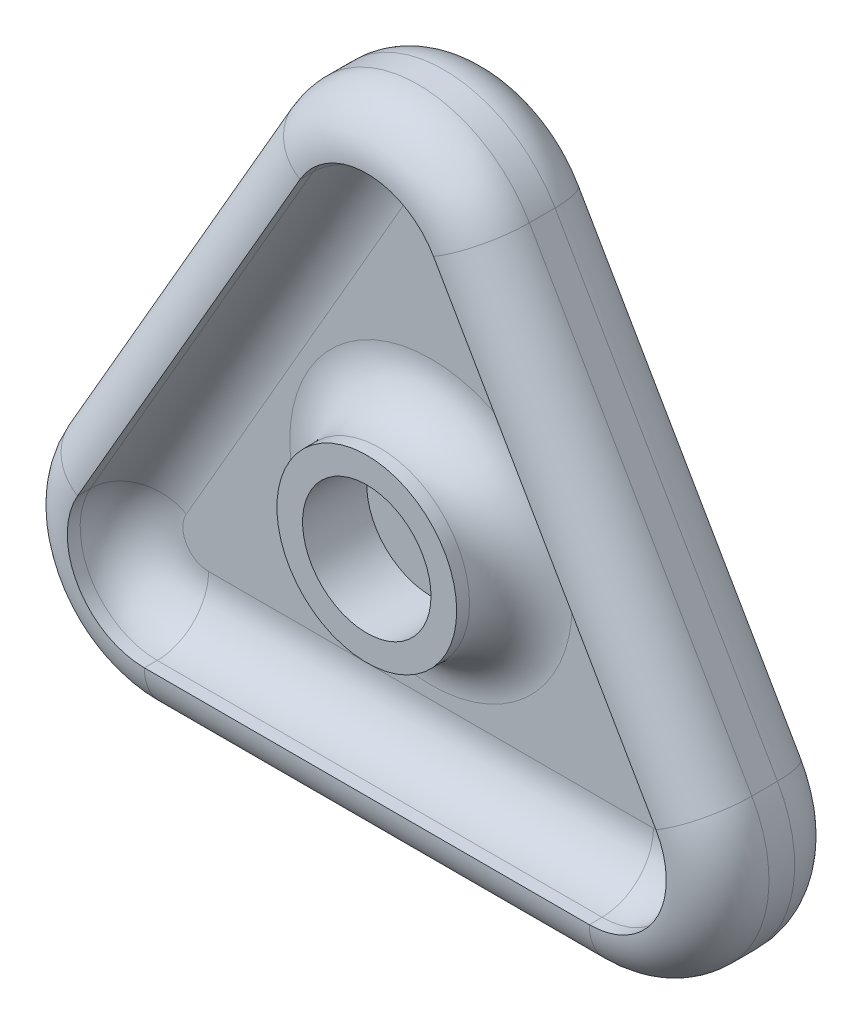
ISO-10303-21;
HEADER;
FILE_DESCRIPTION(('STEP AP214'),'2;1');
FILE_NAME('part.step','',(''),(''),'','','');
FILE_SCHEMA(('AUTOMOTIVE_DESIGN { 1 0 10303 214 1 1 1 1 }'));
ENDSEC;
DATA;
#1=APPLICATION_CONTEXT('core data for automotive mechanical design processes');
#2=APPLICATION_PROTOCOL_DEFINITION('international standard','automotive_design',2000,#1);
#3=PRODUCT_CONTEXT('',#1,'mechanical');
#4=PRODUCT('Part','Part','',(#3));
#5=PRODUCT_RELATED_PRODUCT_CATEGORY('part','',(#4));
#6=PRODUCT_DEFINITION_FORMATION('','',#4);
#7=PRODUCT_DEFINITION_CONTEXT('part definition',#1,'design');
#8=PRODUCT_DEFINITION('design','',#6,#7);
#9=PRODUCT_DEFINITION_SHAPE('','',#8);
#10=(LENGTH_UNIT() NAMED_UNIT(*) SI_UNIT(.MILLI.,.METRE.));
#11=(NAMED_UNIT(*) PLANE_ANGLE_UNIT() SI_UNIT($,.RADIAN.));
#12=(NAMED_UNIT(*) SI_UNIT($,.STERADIAN.) SOLID_ANGLE_UNIT());
#13=UNCERTAINTY_MEASURE_WITH_UNIT(LENGTH_MEASURE(1.E-05),#10,'distance_accuracy_value','');
#14=(GEOMETRIC_REPRESENTATION_CONTEXT(3) GLOBAL_UNCERTAINTY_ASSIGNED_CONTEXT((#13)) GLOBAL_UNIT_ASSIGNED_CONTEXT((#10,
#11,#12)) REPRESENTATION_CONTEXT('',''));
#15=CARTESIAN_POINT('',(0.,0.,0.));
#16=DIRECTION('',(0.,0.,1.));
#17=DIRECTION('',(1.,0.,0.));
#18=AXIS2_PLACEMENT_3D('',#15,#16,#17);
#19=CARTESIAN_POINT('',(17.3205080756888,-10.,8.0742429890584));
#20=DIRECTION('',(0.,0.,-1.));
#21=DIRECTION('',(-1.,0.,0.));
#22=AXIS2_PLACEMENT_3D('',#19,#20,#21);
#23=CYLINDRICAL_SURFACE('',#22,10.);
#24=DIRECTION('',(0.,0.,-1.));
#25=VECTOR('',#24,1.);
#26=CARTESIAN_POINT('',(17.3205080756886,-20.,8.0742429890584));
#27=LINE('',#26,#25);
#28=CARTESIAN_POINT('',(17.3205080756886,-20.,4.0742429890584));
#29=VERTEX_POINT('',#28);
#30=CARTESIAN_POINT('',(17.3205080756886,-20.,2.0742429890584));
#31=VERTEX_POINT('',#30);
#32=EDGE_CURVE('E227',#29,#31,#27,.T.);
#33=ORIENTED_EDGE('',*,*,#32,.T.);
#34=CARTESIAN_POINT('',(17.3205080756888,-10.,2.0742429890584));
#35=DIRECTION('',(0.,0.,-1.));
#36=DIRECTION('',(-1.,0.,0.));
#37=AXIS2_PLACEMENT_3D('',#34,#35,#36);
#38=CIRCLE('',#37,10.);
#39=CARTESIAN_POINT('',(25.9807621135331,-4.99999999999989,2.0742429890584));
#40=VERTEX_POINT('',#39);
#41=EDGE_CURVE('E11',#31,#40,#38,.F.);
#42=ORIENTED_EDGE('',*,*,#41,.T.);
#43=DIRECTION('',(0.,0.,-1.));
#44=VECTOR('',#43,1.);
#45=CARTESIAN_POINT('',(25.9807621135331,-4.99999999999989,8.0742429890584));
#46=LINE('',#45,#44);
#47=CARTESIAN_POINT('',(25.9807621135331,-4.99999999999989,4.0742429890584));
#48=VERTEX_POINT('',#47);
#49=EDGE_CURVE('E253',#48,#40,#46,.T.);
#50=ORIENTED_EDGE('',*,*,#49,.F.);
#51=CARTESIAN_POINT('',(17.3205080756888,-10.,4.0742429890584));
#52=DIRECTION('',(0.,0.,-1.));
#53=DIRECTION('',(-1.,0.,0.));
#54=AXIS2_PLACEMENT_3D('',#51,#52,#53);
#55=CIRCLE('',#54,10.);
#56=EDGE_CURVE('E269',#48,#29,#55,.T.);
#57=ORIENTED_EDGE('',*,*,#56,.T.);
#58=EDGE_LOOP('',(#33,#42,#50,#57));
#59=FACE_BOUND('',#58,.T.);
#60=ADVANCED_FACE('F38',(#59),#23,.T.);
#61=CARTESIAN_POINT('',(25.9807621135331,-4.99999999999989,8.0742429890584));
#62=DIRECTION('',(-0.866025403784439,-0.5,0.));
#63=DIRECTION('',(0.5,-0.866025403784439,0.));
#64=AXIS2_PLACEMENT_3D('',#61,#62,#63);
#65=PLANE('',#64);
#66=ORIENTED_EDGE('',*,*,#49,.T.);
#67=DIRECTION('',(-0.5,0.866025403784439,0.));
#68=VECTOR('',#67,1.);
#69=CARTESIAN_POINT('',(8.66025403784446,24.9999999999999,2.0742429890584));
#70=LINE('',#69,#68);
#71=CARTESIAN_POINT('',(8.66025403784446,24.9999999999999,2.0742429890584));
#72=VERTEX_POINT('',#71);
#73=EDGE_CURVE('E315',#40,#72,#70,.T.);
#74=ORIENTED_EDGE('',*,*,#73,.T.);
#75=DIRECTION('',(0.,0.,-1.));
#76=VECTOR('',#75,1.);
#77=CARTESIAN_POINT('',(8.66025403784446,24.9999999999999,8.0742429890584));
#78=LINE('',#77,#76);
#79=CARTESIAN_POINT('',(8.66025403784446,24.9999999999999,4.0742429890584));
#80=VERTEX_POINT('',#79);
#81=EDGE_CURVE('E249',#80,#72,#78,.T.);
#82=ORIENTED_EDGE('',*,*,#81,.F.);
#83=DIRECTION('',(-0.5,0.866025403784439,0.));
#84=VECTOR('',#83,1.);
#85=CARTESIAN_POINT('',(25.9807621135331,-4.99999999999989,4.0742429890584));
#86=LINE('',#85,#84);
#87=EDGE_CURVE('E197',#80,#48,#86,.F.);
#88=ORIENTED_EDGE('',*,*,#87,.T.);
#89=EDGE_LOOP('',(#66,#74,#82,#88));
#90=FACE_BOUND('',#89,.T.);
#91=ADVANCED_FACE('F388',(#90),#65,.F.);
#92=CARTESIAN_POINT('',(0.,20.,8.0742429890584));
#93=DIRECTION('',(0.,0.,-1.));
#94=DIRECTION('',(-1.,0.,0.));
#95=AXIS2_PLACEMENT_3D('',#92,#93,#94);
#96=CYLINDRICAL_SURFACE('',#95,10.);
#97=ORIENTED_EDGE('',*,*,#81,.T.);
#98=CARTESIAN_POINT('',(0.,20.,2.0742429890584));
#99=DIRECTION('',(0.,0.,-1.));
#100=DIRECTION('',(-1.,0.,0.));
#101=AXIS2_PLACEMENT_3D('',#98,#99,#100);
#102=CIRCLE('',#101,10.);
#103=CARTESIAN_POINT('',(-8.66025403784445,24.9999999999999,2.0742429890584));
#104=VERTEX_POINT('',#103);
#105=EDGE_CURVE('E346',#72,#104,#102,.F.);
#106=ORIENTED_EDGE('',*,*,#105,.T.);
#107=DIRECTION('',(0.,0.,-1.));
#108=VECTOR('',#107,1.);
#109=CARTESIAN_POINT('',(-8.66025403784445,24.9999999999999,8.0742429890584));
#110=LINE('',#109,#108);
#111=CARTESIAN_POINT('',(-8.66025403784445,24.9999999999999,4.0742429890584));
#112=VERTEX_POINT('',#111);
#113=EDGE_CURVE('E245',#112,#104,#110,.T.);
#114=ORIENTED_EDGE('',*,*,#113,.F.);
#115=CARTESIAN_POINT('',(0.,20.,4.0742429890584));
#116=DIRECTION('',(0.,0.,-1.));
#117=DIRECTION('',(-1.,0.,0.));
#118=AXIS2_PLACEMENT_3D('',#115,#116,#117);
#119=CIRCLE('',#118,10.);
#120=EDGE_CURVE('E266',#112,#80,#119,.T.);
#121=ORIENTED_EDGE('',*,*,#120,.T.);
#122=EDGE_LOOP('',(#97,#106,#114,#121));
#123=FACE_BOUND('',#122,.T.);
#124=ADVANCED_FACE('F391',(#123),#96,.T.);
#125=CARTESIAN_POINT('',(-8.66025403784445,24.9999999999999,8.0742429890584));
#126=DIRECTION('',(0.866025403784439,-0.5,0.));
#127=DIRECTION('',(0.5,0.866025403784439,0.));
#128=AXIS2_PLACEMENT_3D('',#125,#126,#127);
#129=PLANE('',#128);
#130=ORIENTED_EDGE('',*,*,#113,.T.);
#131=DIRECTION('',(-0.5,-0.866025403784439,0.));
#132=VECTOR('',#131,1.);
#133=CARTESIAN_POINT('',(-25.9807621135331,-4.99999999999989,2.0742429890584));
#134=LINE('',#133,#132);
#135=CARTESIAN_POINT('',(-25.9807621135331,-4.99999999999989,2.0742429890584));
#136=VERTEX_POINT('',#135);
#137=EDGE_CURVE('E348',#104,#136,#134,.T.);
#138=ORIENTED_EDGE('',*,*,#137,.T.);
#139=DIRECTION('',(0.,0.,-1.));
#140=VECTOR('',#139,1.);
#141=CARTESIAN_POINT('',(-25.9807621135331,-4.99999999999989,8.0742429890584));
#142=LINE('',#141,#140);
#143=CARTESIAN_POINT('',(-25.9807621135331,-4.99999999999989,4.0742429890584));
#144=VERTEX_POINT('',#143);
#145=EDGE_CURVE('E242',#144,#136,#142,.T.);
#146=ORIENTED_EDGE('',*,*,#145,.F.);
#147=DIRECTION('',(-0.5,-0.866025403784439,0.));
#148=VECTOR('',#147,1.);
#149=CARTESIAN_POINT('',(-8.66025403784445,24.9999999999999,4.0742429890584));
#150=LINE('',#149,#148);
#151=EDGE_CURVE('E264',#144,#112,#150,.F.);
#152=ORIENTED_EDGE('',*,*,#151,.T.);
#153=EDGE_LOOP('',(#130,#138,#146,#152));
#154=FACE_BOUND('',#153,.T.);
#155=ADVANCED_FACE('F683',(#154),#129,.F.);
#156=CARTESIAN_POINT('',(-17.3205080756888,-10.,8.0742429890584));
#157=DIRECTION('',(0.,0.,-1.));
#158=DIRECTION('',(-1.,0.,0.));
#159=AXIS2_PLACEMENT_3D('',#156,#157,#158);
#160=CYLINDRICAL_SURFACE('',#159,9.99999999999999);
#161=ORIENTED_EDGE('',*,*,#145,.T.);
#162=CARTESIAN_POINT('',(-17.3205080756888,-10.,2.0742429890584));
#163=DIRECTION('',(0.,0.,-1.));
#164=DIRECTION('',(-1.,0.,0.));
#165=AXIS2_PLACEMENT_3D('',#162,#163,#164);
#166=CIRCLE('',#165,9.99999999999999);
#167=CARTESIAN_POINT('',(-17.3205080756886,-20.,2.0742429890584));
#168=VERTEX_POINT('',#167);
#169=EDGE_CURVE('E62',#136,#168,#166,.F.);
#170=ORIENTED_EDGE('',*,*,#169,.T.);
#171=DIRECTION('',(0.,0.,-1.));
#172=VECTOR('',#171,1.);
#173=CARTESIAN_POINT('',(-17.3205080756886,-20.,8.0742429890584));
#174=LINE('',#173,#172);
#175=CARTESIAN_POINT('',(-17.3205080756886,-20.,4.0742429890584));
#176=VERTEX_POINT('',#175);
#177=EDGE_CURVE('E240',#176,#168,#174,.T.);
#178=ORIENTED_EDGE('',*,*,#177,.F.);
#179=CARTESIAN_POINT('',(-17.3205080756888,-10.,4.0742429890584));
#180=DIRECTION('',(0.,0.,-1.));
#181=DIRECTION('',(-1.,0.,0.));
#182=AXIS2_PLACEMENT_3D('',#179,#180,#181);
#183=CIRCLE('',#182,9.99999999999999);
#184=EDGE_CURVE('E261',#176,#144,#183,.T.);
#185=ORIENTED_EDGE('',*,*,#184,.T.);
#186=EDGE_LOOP('',(#161,#170,#178,#185));
#187=FACE_BOUND('',#186,.T.);
#188=ADVANCED_FACE('F674',(#187),#160,.T.);
#189=CARTESIAN_POINT('',(-17.3205080756886,-20.,8.0742429890584));
#190=DIRECTION('',(0.,1.,0.));
#191=DIRECTION('',(-1.,0.,0.));
#192=AXIS2_PLACEMENT_3D('',#189,#190,#191);
#193=PLANE('',#192);
#194=ORIENTED_EDGE('',*,*,#177,.T.);
#195=DIRECTION('',(1.,0.,0.));
#196=VECTOR('',#195,1.);
#197=CARTESIAN_POINT('',(17.3205080756886,-20.,2.0742429890584));
#198=LINE('',#197,#196);
#199=EDGE_CURVE('E47',#168,#31,#198,.T.);
#200=ORIENTED_EDGE('',*,*,#199,.T.);
#201=ORIENTED_EDGE('',*,*,#32,.F.);
#202=DIRECTION('',(1.,0.,0.));
#203=VECTOR('',#202,1.);
#204=CARTESIAN_POINT('',(-17.3205080756886,-20.,4.0742429890584));
#205=LINE('',#204,#203);
#206=EDGE_CURVE('E271',#29,#176,#205,.F.);
#207=ORIENTED_EDGE('',*,*,#206,.T.);
#208=EDGE_LOOP('',(#194,#200,#201,#207));
#209=FACE_BOUND('',#208,.T.);
#210=ADVANCED_FACE('F665',(#209),#193,.F.);
#211=CARTESIAN_POINT('',(17.3205080756888,-10.,-1.9257570109416));
#212=DIRECTION('',(0.,0.,-1.));
#213=DIRECTION('',(-1.,0.,0.));
#214=AXIS2_PLACEMENT_3D('',#211,#212,#213);
#215=PLANE('',#214);
#216=CARTESIAN_POINT('',(0.,20.,-1.9257570109416));
#217=DIRECTION('',(0.,0.,-1.));
#218=DIRECTION('',(-1.,0.,0.));
#219=AXIS2_PLACEMENT_3D('',#216,#217,#218);
#220=CIRCLE('',#219,6.);
#221=CARTESIAN_POINT('',(-5.19615242270667,22.9999999999999,-1.9257570109416));
#222=VERTEX_POINT('',#221);
#223=CARTESIAN_POINT('',(5.1961524227067,22.9999999999999,-1.9257570109416));
#224=VERTEX_POINT('',#223);
#225=EDGE_CURVE('E341',#222,#224,#220,.T.);
#226=ORIENTED_EDGE('',*,*,#225,.T.);
#227=DIRECTION('',(-0.5,0.866025403784439,0.));
#228=VECTOR('',#227,1.);
#229=CARTESIAN_POINT('',(22.5166604983953,-6.99999999999989,-1.9257570109416));
#230=LINE('',#229,#228);
#231=CARTESIAN_POINT('',(22.5166604983953,-6.99999999999989,-1.9257570109416));
#232=VERTEX_POINT('',#231);
#233=EDGE_CURVE('E343',#224,#232,#230,.F.);
#234=ORIENTED_EDGE('',*,*,#233,.T.);
#235=CARTESIAN_POINT('',(17.3205080756888,-10.,-1.9257570109416));
#236=DIRECTION('',(0.,0.,-1.));
#237=DIRECTION('',(-1.,0.,0.));
#238=AXIS2_PLACEMENT_3D('',#235,#236,#237);
#239=CIRCLE('',#238,6.);
#240=CARTESIAN_POINT('',(17.3205080756886,-16.,-1.9257570109416));
#241=VERTEX_POINT('',#240);
#242=EDGE_CURVE('E333',#232,#241,#239,.T.);
#243=ORIENTED_EDGE('',*,*,#242,.T.);
#244=DIRECTION('',(1.,0.,0.));
#245=VECTOR('',#244,1.);
#246=CARTESIAN_POINT('',(-17.3205080756886,-16.,-1.9257570109416));
#247=LINE('',#246,#245);
#248=CARTESIAN_POINT('',(-17.3205080756887,-16.,-1.9257570109416));
#249=VERTEX_POINT('',#248);
#250=EDGE_CURVE('E335',#241,#249,#247,.F.);
#251=ORIENTED_EDGE('',*,*,#250,.T.);
#252=CARTESIAN_POINT('',(-17.3205080756888,-10.,-1.9257570109416));
#253=DIRECTION('',(0.,0.,-1.));
#254=DIRECTION('',(-1.,0.,0.));
#255=AXIS2_PLACEMENT_3D('',#252,#253,#254);
#256=CIRCLE('',#255,5.99999999999999);
#257=CARTESIAN_POINT('',(-22.5166604983953,-6.99999999999989,-1.9257570109416));
#258=VERTEX_POINT('',#257);
#259=EDGE_CURVE('E337',#249,#258,#256,.T.);
#260=ORIENTED_EDGE('',*,*,#259,.T.);
#261=DIRECTION('',(-0.5,-0.866025403784439,0.));
#262=VECTOR('',#261,1.);
#263=CARTESIAN_POINT('',(-5.1961524227067,22.9999999999999,-1.9257570109416));
#264=LINE('',#263,#262);
#265=EDGE_CURVE('E339',#258,#222,#264,.F.);
#266=ORIENTED_EDGE('',*,*,#265,.T.);
#267=EDGE_LOOP('',(#226,#234,#243,#251,#260,#266));
#268=FACE_BOUND('',#267,.T.);
#269=ADVANCED_FACE('F376',(#268),#215,.T.);
#270=CARTESIAN_POINT('',(17.3205080756888,-10.,3.0742429890584));
#271=DIRECTION('',(0.,0.,1.));
#272=DIRECTION('',(1.,0.,0.));
#273=AXIS2_PLACEMENT_3D('',#270,#271,#272);
#274=CYLINDRICAL_SURFACE('',#273,6.);
#275=DIRECTION('',(0.,0.,1.));
#276=VECTOR('',#275,1.);
#277=CARTESIAN_POINT('',(22.5166604983954,-6.99999999999993,3.0742429890584));
#278=LINE('',#277,#276);
#279=CARTESIAN_POINT('',(22.5166604983954,-6.99999999999993,7.0742429890584));
#280=VERTEX_POINT('',#279);
#281=CARTESIAN_POINT('',(22.5166604983954,-6.99999999999993,8.0742429890584));
#282=VERTEX_POINT('',#281);
#283=EDGE_CURVE('E179',#280,#282,#278,.T.);
#284=ORIENTED_EDGE('',*,*,#283,.F.);
#285=CARTESIAN_POINT('',(17.3205080756888,-10.,7.0742429890584));
#286=DIRECTION('',(0.,0.,1.));
#287=DIRECTION('',(1.,0.,0.));
#288=AXIS2_PLACEMENT_3D('',#285,#286,#287);
#289=CIRCLE('',#288,6.);
#290=CARTESIAN_POINT('',(17.3205080756887,-16.,7.0742429890584));
#291=VERTEX_POINT('',#290);
#292=EDGE_CURVE('E310',#280,#291,#289,.F.);
#293=ORIENTED_EDGE('',*,*,#292,.T.);
#294=DIRECTION('',(0.,0.,1.));
#295=VECTOR('',#294,1.);
#296=CARTESIAN_POINT('',(17.3205080756887,-16.,3.0742429890584));
#297=LINE('',#296,#295);
#298=CARTESIAN_POINT('',(17.3205080756887,-16.,8.0742429890584));
#299=VERTEX_POINT('',#298);
#300=EDGE_CURVE('E224',#291,#299,#297,.T.);
#301=ORIENTED_EDGE('',*,*,#300,.T.);
#302=CARTESIAN_POINT('',(17.3205080756888,-10.,8.0742429890584));
#303=DIRECTION('',(0.,0.,1.));
#304=DIRECTION('',(1.,0.,0.));
#305=AXIS2_PLACEMENT_3D('',#302,#303,#304);
#306=CIRCLE('',#305,6.);
#307=EDGE_CURVE('E191',#299,#282,#306,.T.);
#308=ORIENTED_EDGE('',*,*,#307,.T.);
#309=EDGE_LOOP('',(#284,#293,#301,#308));
#310=FACE_BOUND('',#309,.T.);
#311=ADVANCED_FACE('F423',(#310),#274,.F.);
#312=CARTESIAN_POINT('',(-17.3205080756887,-16.,3.0742429890584));
#313=DIRECTION('',(0.,-1.,0.));
#314=DIRECTION('',(1.,0.,0.));
#315=AXIS2_PLACEMENT_3D('',#312,#313,#314);
#316=PLANE('',#315);
#317=ORIENTED_EDGE('',*,*,#300,.F.);
#318=DIRECTION('',(1.,0.,0.));
#319=VECTOR('',#318,1.);
#320=CARTESIAN_POINT('',(-17.3205080756887,-16.,7.0742429890584));
#321=LINE('',#320,#319);
#322=CARTESIAN_POINT('',(-17.3205080756887,-16.,7.0742429890584));
#323=VERTEX_POINT('',#322);
#324=EDGE_CURVE('E300',#291,#323,#321,.F.);
#325=ORIENTED_EDGE('',*,*,#324,.T.);
#326=DIRECTION('',(0.,0.,1.));
#327=VECTOR('',#326,1.);
#328=CARTESIAN_POINT('',(-17.3205080756887,-16.,3.0742429890584));
#329=LINE('',#328,#327);
#330=CARTESIAN_POINT('',(-17.3205080756887,-16.,8.0742429890584));
#331=VERTEX_POINT('',#330);
#332=EDGE_CURVE('E228',#323,#331,#329,.T.);
#333=ORIENTED_EDGE('',*,*,#332,.T.);
#334=DIRECTION('',(1.,0.,0.));
#335=VECTOR('',#334,1.);
#336=CARTESIAN_POINT('',(-17.3205080756887,-16.,8.0742429890584));
#337=LINE('',#336,#335);
#338=EDGE_CURVE('E221',#331,#299,#337,.T.);
#339=ORIENTED_EDGE('',*,*,#338,.T.);
#340=EDGE_LOOP('',(#317,#325,#333,#339));
#341=FACE_BOUND('',#340,.T.);
#342=ADVANCED_FACE('F637',(#341),#316,.F.);
#343=CARTESIAN_POINT('',(-17.3205080756888,-10.,3.0742429890584));
#344=DIRECTION('',(0.,0.,1.));
#345=DIRECTION('',(1.,0.,0.));
#346=AXIS2_PLACEMENT_3D('',#343,#344,#345);
#347=CYLINDRICAL_SURFACE('',#346,5.99999999999999);
#348=ORIENTED_EDGE('',*,*,#332,.F.);
#349=CARTESIAN_POINT('',(-17.3205080756888,-10.,7.0742429890584));
#350=DIRECTION('',(0.,0.,1.));
#351=DIRECTION('',(1.,0.,0.));
#352=AXIS2_PLACEMENT_3D('',#349,#350,#351);
#353=CIRCLE('',#352,5.99999999999999);
#354=CARTESIAN_POINT('',(-22.5166604983953,-6.99999999999989,7.0742429890584));
#355=VERTEX_POINT('',#354);
#356=EDGE_CURVE('E303',#323,#355,#353,.F.);
#357=ORIENTED_EDGE('',*,*,#356,.T.);
#358=DIRECTION('',(0.,0.,1.));
#359=VECTOR('',#358,1.);
#360=CARTESIAN_POINT('',(-22.5166604983953,-6.99999999999989,3.0742429890584));
#361=LINE('',#360,#359);
#362=CARTESIAN_POINT('',(-22.5166604983953,-6.99999999999989,8.0742429890584));
#363=VERTEX_POINT('',#362);
#364=EDGE_CURVE('E231',#355,#363,#361,.T.);
#365=ORIENTED_EDGE('',*,*,#364,.T.);
#366=CARTESIAN_POINT('',(-17.3205080756888,-10.,8.0742429890584));
#367=DIRECTION('',(0.,0.,1.));
#368=DIRECTION('',(1.,0.,0.));
#369=AXIS2_PLACEMENT_3D('',#366,#367,#368);
#370=CIRCLE('',#369,5.99999999999999);
#371=EDGE_CURVE('E214',#363,#331,#370,.T.);
#372=ORIENTED_EDGE('',*,*,#371,.T.);
#373=EDGE_LOOP('',(#348,#357,#365,#372));
#374=FACE_BOUND('',#373,.T.);
#375=ADVANCED_FACE('F628',(#374),#347,.F.);
#376=CARTESIAN_POINT('',(-5.19615242270667,22.9999999999999,3.0742429890584));
#377=DIRECTION('',(-0.866025403784439,0.5,0.));
#378=DIRECTION('',(-0.5,-0.866025403784439,0.));
#379=AXIS2_PLACEMENT_3D('',#376,#377,#378);
#380=PLANE('',#379);
#381=ORIENTED_EDGE('',*,*,#364,.F.);
#382=DIRECTION('',(-0.5,-0.866025403784439,0.));
#383=VECTOR('',#382,1.);
#384=CARTESIAN_POINT('',(-5.19615242270667,22.9999999999999,7.0742429890584));
#385=LINE('',#384,#383);
#386=CARTESIAN_POINT('',(-5.19615242270667,22.9999999999999,7.0742429890584));
#387=VERTEX_POINT('',#386);
#388=EDGE_CURVE('E305',#355,#387,#385,.F.);
#389=ORIENTED_EDGE('',*,*,#388,.T.);
#390=DIRECTION('',(0.,0.,1.));
#391=VECTOR('',#390,1.);
#392=CARTESIAN_POINT('',(-5.19615242270667,22.9999999999999,3.0742429890584));
#393=LINE('',#392,#391);
#394=CARTESIAN_POINT('',(-5.19615242270667,22.9999999999999,8.0742429890584));
#395=VERTEX_POINT('',#394);
#396=EDGE_CURVE('E178',#387,#395,#393,.T.);
#397=ORIENTED_EDGE('',*,*,#396,.T.);
#398=DIRECTION('',(-0.5,-0.866025403784439,0.));
#399=VECTOR('',#398,1.);
#400=CARTESIAN_POINT('',(-5.19615242270667,22.9999999999999,8.0742429890584));
#401=LINE('',#400,#399);
#402=EDGE_CURVE('E208',#395,#363,#401,.T.);
#403=ORIENTED_EDGE('',*,*,#402,.T.);
#404=EDGE_LOOP('',(#381,#389,#397,#403));
#405=FACE_BOUND('',#404,.T.);
#406=ADVANCED_FACE('F401',(#405),#380,.F.);
#407=CARTESIAN_POINT('',(0.,20.,3.0742429890584));
#408=DIRECTION('',(0.,0.,1.));
#409=DIRECTION('',(1.,0.,0.));
#410=AXIS2_PLACEMENT_3D('',#407,#408,#409);
#411=CYLINDRICAL_SURFACE('',#410,6.);
#412=ORIENTED_EDGE('',*,*,#396,.F.);
#413=CARTESIAN_POINT('',(0.,20.,7.0742429890584));
#414=DIRECTION('',(0.,0.,1.));
#415=DIRECTION('',(1.,0.,0.));
#416=AXIS2_PLACEMENT_3D('',#413,#414,#415);
#417=CIRCLE('',#416,6.);
#418=CARTESIAN_POINT('',(5.1961524227067,22.9999999999999,7.0742429890584));
#419=VERTEX_POINT('',#418);
#420=EDGE_CURVE('E174',#387,#419,#417,.F.);
#421=ORIENTED_EDGE('',*,*,#420,.T.);
#422=DIRECTION('',(0.,0.,1.));
#423=VECTOR('',#422,1.);
#424=CARTESIAN_POINT('',(5.1961524227067,22.9999999999999,3.0742429890584));
#425=LINE('',#424,#423);
#426=CARTESIAN_POINT('',(5.1961524227067,22.9999999999999,8.0742429890584));
#427=VERTEX_POINT('',#426);
#428=EDGE_CURVE('E166',#419,#427,#425,.T.);
#429=ORIENTED_EDGE('',*,*,#428,.T.);
#430=CARTESIAN_POINT('',(0.,20.,8.0742429890584));
#431=DIRECTION('',(0.,0.,1.));
#432=DIRECTION('',(1.,0.,0.));
#433=AXIS2_PLACEMENT_3D('',#430,#431,#432);
#434=CIRCLE('',#433,6.);
#435=EDGE_CURVE('E171',#427,#395,#434,.T.);
#436=ORIENTED_EDGE('',*,*,#435,.T.);
#437=EDGE_LOOP('',(#412,#421,#429,#436));
#438=FACE_BOUND('',#437,.T.);
#439=ADVANCED_FACE('F169',(#438),#411,.F.);
#440=CARTESIAN_POINT('',(22.5166604983954,-6.99999999999993,3.0742429890584));
#441=DIRECTION('',(0.866025403784439,0.5,0.));
#442=DIRECTION('',(-0.5,0.866025403784439,0.));
#443=AXIS2_PLACEMENT_3D('',#440,#441,#442);
#444=PLANE('',#443);
#445=ORIENTED_EDGE('',*,*,#428,.F.);
#446=DIRECTION('',(-0.5,0.866025403784439,0.));
#447=VECTOR('',#446,1.);
#448=CARTESIAN_POINT('',(22.5166604983954,-6.99999999999993,7.0742429890584));
#449=LINE('',#448,#447);
#450=EDGE_CURVE('E308',#419,#280,#449,.F.);
#451=ORIENTED_EDGE('',*,*,#450,.T.);
#452=ORIENTED_EDGE('',*,*,#283,.T.);
#453=DIRECTION('',(-0.5,0.866025403784439,0.));
#454=VECTOR('',#453,1.);
#455=CARTESIAN_POINT('',(22.5166604983954,-6.99999999999993,8.0742429890584));
#456=LINE('',#455,#454);
#457=EDGE_CURVE('E182',#282,#427,#456,.T.);
#458=ORIENTED_EDGE('',*,*,#457,.T.);
#459=EDGE_LOOP('',(#445,#451,#452,#458));
#460=FACE_BOUND('',#459,.T.);
#461=ADVANCED_FACE('F184',(#460),#444,.F.);
#462=CARTESIAN_POINT('',(17.3205080756888,-10.,3.0742429890584));
#463=DIRECTION('',(0.,0.,1.));
#464=DIRECTION('',(1.,0.,0.));
#465=AXIS2_PLACEMENT_3D('',#462,#463,#464);
#466=PLANE('',#465);
#467=CARTESIAN_POINT('',(-17.3205080756888,-10.,3.0742429890584));
#468=DIRECTION('',(0.,0.,1.));
#469=DIRECTION('',(1.,0.,0.));
#470=AXIS2_PLACEMENT_3D('',#467,#468,#469);
#471=CIRCLE('',#470,1.99999999999999);
#472=CARTESIAN_POINT('',(-19.0525588832576,-8.99999999999997,3.0742429890584));
#473=VERTEX_POINT('',#472);
#474=CARTESIAN_POINT('',(-17.3205080756887,-12.,3.0742429890584));
#475=VERTEX_POINT('',#474);
#476=EDGE_CURVE('E295',#473,#475,#471,.T.);
#477=ORIENTED_EDGE('',*,*,#476,.T.);
#478=DIRECTION('',(1.,0.,0.));
#479=VECTOR('',#478,1.);
#480=CARTESIAN_POINT('',(17.3205080756888,-12.,3.0742429890584));
#481=LINE('',#480,#479);
#482=CARTESIAN_POINT('',(17.3205080756887,-12.,3.0742429890584));
#483=VERTEX_POINT('',#482);
#484=EDGE_CURVE('E297',#475,#483,#481,.T.);
#485=ORIENTED_EDGE('',*,*,#484,.T.);
#486=CARTESIAN_POINT('',(17.3205080756888,-10.,3.0742429890584));
#487=DIRECTION('',(0.,0.,1.));
#488=DIRECTION('',(1.,0.,0.));
#489=AXIS2_PLACEMENT_3D('',#486,#487,#488);
#490=CIRCLE('',#489,2.);
#491=CARTESIAN_POINT('',(19.0525588832576,-8.99999999999993,3.0742429890584));
#492=VERTEX_POINT('',#491);
#493=EDGE_CURVE('E287',#483,#492,#490,.T.);
#494=ORIENTED_EDGE('',*,*,#493,.T.);
#495=DIRECTION('',(-0.5,0.866025403784439,0.));
#496=VECTOR('',#495,1.);
#497=CARTESIAN_POINT('',(19.0525588832577,-9.,3.0742429890584));
#498=LINE('',#497,#496);
#499=CARTESIAN_POINT('',(1.7320508075689,21.,3.0742429890584));
#500=VERTEX_POINT('',#499);
#501=EDGE_CURVE('E289',#492,#500,#498,.T.);
#502=ORIENTED_EDGE('',*,*,#501,.T.);
#503=CARTESIAN_POINT('',(0.,20.,3.0742429890584));
#504=DIRECTION('',(0.,0.,1.));
#505=DIRECTION('',(1.,0.,0.));
#506=AXIS2_PLACEMENT_3D('',#503,#504,#505);
#507=CIRCLE('',#506,2.);
#508=CARTESIAN_POINT('',(-1.73205080756891,20.9999999999999,3.0742429890584));
#509=VERTEX_POINT('',#508);
#510=EDGE_CURVE('E291',#500,#509,#507,.T.);
#511=ORIENTED_EDGE('',*,*,#510,.T.);
#512=DIRECTION('',(-0.5,-0.866025403784439,0.));
#513=VECTOR('',#512,1.);
#514=CARTESIAN_POINT('',(-10.3923048454133,5.99999999999999,3.0742429890584));
#515=LINE('',#514,#513);
#516=EDGE_CURVE('E293',#509,#473,#515,.T.);
#517=ORIENTED_EDGE('',*,*,#516,.T.);
#518=EDGE_LOOP('',(#477,#485,#494,#502,#511,#517));
#519=FACE_BOUND('',#518,.T.);
#520=CARTESIAN_POINT('',(0.,0.,3.0742429890584));
#521=DIRECTION('',(0.,0.,1.));
#522=DIRECTION('',(1.,0.,0.));
#523=AXIS2_PLACEMENT_3D('',#520,#521,#522);
#524=CIRCLE('',#523,11.);
#525=CARTESIAN_POINT('',(11.,0.,3.0742429890584));
#526=VERTEX_POINT('',#525);
#527=EDGE_CURVE('E273',#526,#526,#524,.F.);
#528=ORIENTED_EDGE('',*,*,#527,.T.);
#529=EDGE_LOOP('',(#528));
#530=FACE_BOUND('',#529,.T.);
#531=ADVANCED_FACE('F414',(#519,#530),#466,.T.);
#532=CARTESIAN_POINT('',(0.,0.,8.0742429890584));
#533=DIRECTION('',(0.,0.,1.));
#534=DIRECTION('',(1.,0.,0.));
#535=AXIS2_PLACEMENT_3D('',#532,#533,#534);
#536=PLANE('',#535);
#537=CARTESIAN_POINT('',(0.,0.,8.0742429890584));
#538=DIRECTION('',(0.,0.,1.));
#539=DIRECTION('',(1.,0.,0.));
#540=AXIS2_PLACEMENT_3D('',#537,#538,#539);
#541=CIRCLE('',#540,7.);
#542=CARTESIAN_POINT('',(7.,0.,8.0742429890584));
#543=VERTEX_POINT('',#542);
#544=EDGE_CURVE('E429',#543,#543,#541,.T.);
#545=ORIENTED_EDGE('',*,*,#544,.T.);
#546=EDGE_LOOP('',(#545));
#547=FACE_BOUND('',#546,.T.);
#548=CARTESIAN_POINT('',(0.,0.,8.0742429890584));
#549=DIRECTION('',(0.,0.,1.));
#550=DIRECTION('',(1.,0.,0.));
#551=AXIS2_PLACEMENT_3D('',#548,#549,#550);
#552=CIRCLE('',#551,5.);
#553=CARTESIAN_POINT('',(5.,0.,8.0742429890584));
#554=VERTEX_POINT('',#553);
#555=EDGE_CURVE('E200',#554,#554,#552,.T.);
#556=ORIENTED_EDGE('',*,*,#555,.F.);
#557=EDGE_LOOP('',(#556));
#558=FACE_BOUND('',#557,.T.);
#559=ADVANCED_FACE('F441',(#547,#558),#536,.T.);
#560=CARTESIAN_POINT('',(0.,0.,8.0742429890584));
#561=DIRECTION('',(0.,0.,-1.));
#562=DIRECTION('',(-1.,0.,0.));
#563=AXIS2_PLACEMENT_3D('',#560,#561,#562);
#564=CYLINDRICAL_SURFACE('',#563,7.);
#565=CARTESIAN_POINT('',(0.,0.,7.0742429890584));
#566=DIRECTION('',(0.,0.,1.));
#567=DIRECTION('',(1.,0.,0.));
#568=AXIS2_PLACEMENT_3D('',#565,#566,#567);
#569=CIRCLE('',#568,7.);
#570=CARTESIAN_POINT('',(7.,0.,7.0742429890584));
#571=VERTEX_POINT('',#570);
#572=EDGE_CURVE('E312',#571,#571,#569,.T.);
#573=ORIENTED_EDGE('',*,*,#572,.T.);
#574=EDGE_LOOP('',(#573));
#575=FACE_BOUND('',#574,.T.);
#576=ORIENTED_EDGE('',*,*,#544,.F.);
#577=EDGE_LOOP('',(#576));
#578=FACE_BOUND('',#577,.T.);
#579=ADVANCED_FACE('F443',(#575,#578),#564,.T.);
#580=CARTESIAN_POINT('',(0.,0.,8.0742429890584));
#581=DIRECTION('',(0.,0.,-1.));
#582=DIRECTION('',(-1.,0.,0.));
#583=AXIS2_PLACEMENT_3D('',#580,#581,#582);
#584=CYLINDRICAL_SURFACE('',#583,5.);
#585=ORIENTED_EDGE('',*,*,#555,.T.);
#586=EDGE_LOOP('',(#585));
#587=FACE_BOUND('',#586,.T.);
#588=CARTESIAN_POINT('',(0.,0.,3.0742429890584));
#589=DIRECTION('',(0.,0.,1.));
#590=DIRECTION('',(1.,0.,0.));
#591=AXIS2_PLACEMENT_3D('',#588,#589,#590);
#592=CIRCLE('',#591,5.);
#593=CARTESIAN_POINT('',(5.,0.,3.0742429890584));
#594=VERTEX_POINT('',#593);
#595=EDGE_CURVE('E257',#594,#594,#592,.F.);
#596=ORIENTED_EDGE('',*,*,#595,.T.);
#597=EDGE_LOOP('',(#596));
#598=FACE_BOUND('',#597,.T.);
#599=ADVANCED_FACE('F438',(#587,#598),#584,.F.);
#600=ORIENTED_EDGE('',*,*,#595,.F.);
#601=EDGE_LOOP('',(#600));
#602=FACE_BOUND('',#601,.T.);
#603=ADVANCED_FACE('F453',(#602),#466,.T.);
#604=CARTESIAN_POINT('',(22.5166604983954,-7.,4.0742429890584));
#605=DIRECTION('',(-0.5,0.866025403784439,0.));
#606=DIRECTION('',(-0.866025403784439,-0.5,0.));
#607=AXIS2_PLACEMENT_3D('',#604,#605,#606);
#608=CYLINDRICAL_SURFACE('',#607,4.);
#609=CARTESIAN_POINT('',(22.5166604983953,-6.99999999999989,4.0742429890584));
#610=DIRECTION('',(0.5,-0.866025403784439,0.));
#611=DIRECTION('',(0.866025403784439,0.5,0.));
#612=AXIS2_PLACEMENT_3D('',#609,#610,#611);
#613=CIRCLE('',#612,4.);
#614=EDGE_CURVE('E201',#48,#282,#613,.T.);
#615=ORIENTED_EDGE('',*,*,#614,.F.);
#616=ORIENTED_EDGE('',*,*,#87,.F.);
#617=CARTESIAN_POINT('',(5.19615242270668,22.9999999999999,4.0742429890584));
#618=DIRECTION('',(-0.499999999999988,0.866025403784445,0.));
#619=DIRECTION('',(-0.866025403784445,-0.499999999999988,0.));
#620=AXIS2_PLACEMENT_3D('',#617,#618,#619);
#621=CIRCLE('',#620,4.);
#622=EDGE_CURVE('E195',#427,#80,#621,.T.);
#623=ORIENTED_EDGE('',*,*,#622,.F.);
#624=ORIENTED_EDGE('',*,*,#457,.F.);
#625=EDGE_LOOP('',(#615,#616,#623,#624));
#626=FACE_BOUND('',#625,.T.);
#627=ADVANCED_FACE('F196',(#626),#608,.T.);
#628=CARTESIAN_POINT('',(0.,20.,4.0742429890584));
#629=DIRECTION('',(0.,0.,-1.));
#630=DIRECTION('',(-1.,0.,0.));
#631=AXIS2_PLACEMENT_3D('',#628,#629,#630);
#632=TOROIDAL_SURFACE('',#631,6.,4.);
#633=ORIENTED_EDGE('',*,*,#622,.T.);
#634=ORIENTED_EDGE('',*,*,#120,.F.);
#635=CARTESIAN_POINT('',(-5.1961524227067,22.9999999999999,4.0742429890584));
#636=DIRECTION('',(-0.5,-0.866025403784439,0.));
#637=DIRECTION('',(0.866025403784439,-0.5,0.));
#638=AXIS2_PLACEMENT_3D('',#635,#636,#637);
#639=CIRCLE('',#638,4.);
#640=EDGE_CURVE('E205',#395,#112,#639,.T.);
#641=ORIENTED_EDGE('',*,*,#640,.F.);
#642=ORIENTED_EDGE('',*,*,#435,.F.);
#643=EDGE_LOOP('',(#633,#634,#641,#642));
#644=FACE_BOUND('',#643,.T.);
#645=ADVANCED_FACE('F203',(#644),#632,.T.);
#646=CARTESIAN_POINT('',(17.3205080756888,-10.,4.0742429890584));
#647=DIRECTION('',(0.,0.,-1.));
#648=DIRECTION('',(-1.,0.,0.));
#649=AXIS2_PLACEMENT_3D('',#646,#647,#648);
#650=TOROIDAL_SURFACE('',#649,6.,4.);
#651=ORIENTED_EDGE('',*,*,#614,.T.);
#652=ORIENTED_EDGE('',*,*,#307,.F.);
#653=CARTESIAN_POINT('',(17.3205080756887,-16.,4.0742429890584));
#654=DIRECTION('',(-1.,0.,0.));
#655=DIRECTION('',(0.,-1.,0.));
#656=AXIS2_PLACEMENT_3D('',#653,#654,#655);
#657=CIRCLE('',#656,4.);
#658=EDGE_CURVE('E280',#29,#299,#657,.T.);
#659=ORIENTED_EDGE('',*,*,#658,.F.);
#660=ORIENTED_EDGE('',*,*,#56,.F.);
#661=EDGE_LOOP('',(#651,#652,#659,#660));
#662=FACE_BOUND('',#661,.T.);
#663=ADVANCED_FACE('F473',(#662),#650,.T.);
#664=CARTESIAN_POINT('',(-13.856406460551,7.99999999999999,4.0742429890584));
#665=DIRECTION('',(-0.5,-0.866025403784439,0.));
#666=DIRECTION('',(0.866025403784439,-0.5,0.));
#667=AXIS2_PLACEMENT_3D('',#664,#665,#666);
#668=CYLINDRICAL_SURFACE('',#667,4.);
#669=ORIENTED_EDGE('',*,*,#640,.T.);
#670=ORIENTED_EDGE('',*,*,#151,.F.);
#671=CARTESIAN_POINT('',(-22.5166604983954,-6.99999999999994,4.0742429890584));
#672=DIRECTION('',(-0.500000000000012,-0.866025403784431,0.));
#673=DIRECTION('',(0.866025403784432,-0.500000000000012,0.));
#674=AXIS2_PLACEMENT_3D('',#671,#672,#673);
#675=CIRCLE('',#674,4.);
#676=EDGE_CURVE('E277',#363,#144,#675,.T.);
#677=ORIENTED_EDGE('',*,*,#676,.F.);
#678=ORIENTED_EDGE('',*,*,#402,.F.);
#679=EDGE_LOOP('',(#669,#670,#677,#678));
#680=FACE_BOUND('',#679,.T.);
#681=ADVANCED_FACE('F396',(#680),#668,.T.);
#682=CARTESIAN_POINT('',(17.3205080756888,-16.,4.0742429890584));
#683=DIRECTION('',(1.,0.,0.));
#684=DIRECTION('',(0.,1.,0.));
#685=AXIS2_PLACEMENT_3D('',#682,#683,#684);
#686=CYLINDRICAL_SURFACE('',#685,4.);
#687=ORIENTED_EDGE('',*,*,#658,.T.);
#688=ORIENTED_EDGE('',*,*,#338,.F.);
#689=CARTESIAN_POINT('',(-17.3205080756886,-16.,4.0742429890584));
#690=DIRECTION('',(-1.,0.,0.));
#691=DIRECTION('',(0.,0.,1.));
#692=AXIS2_PLACEMENT_3D('',#689,#690,#691);
#693=CIRCLE('',#692,4.);
#694=EDGE_CURVE('E274',#176,#331,#693,.T.);
#695=ORIENTED_EDGE('',*,*,#694,.F.);
#696=ORIENTED_EDGE('',*,*,#206,.F.);
#697=EDGE_LOOP('',(#687,#688,#695,#696));
#698=FACE_BOUND('',#697,.T.);
#699=ADVANCED_FACE('F466',(#698),#686,.T.);
#700=CARTESIAN_POINT('',(-17.3205080756888,-10.,4.0742429890584));
#701=DIRECTION('',(0.,0.,-1.));
#702=DIRECTION('',(-1.,0.,0.));
#703=AXIS2_PLACEMENT_3D('',#700,#701,#702);
#704=TOROIDAL_SURFACE('',#703,5.99999999999999,4.);
#705=ORIENTED_EDGE('',*,*,#676,.T.);
#706=ORIENTED_EDGE('',*,*,#184,.F.);
#707=ORIENTED_EDGE('',*,*,#694,.T.);
#708=ORIENTED_EDGE('',*,*,#371,.F.);
#709=EDGE_LOOP('',(#705,#706,#707,#708));
#710=FACE_BOUND('',#709,.T.);
#711=ADVANCED_FACE('F463',(#710),#704,.T.);
#712=CARTESIAN_POINT('',(0.,20.,7.0742429890584));
#713=DIRECTION('',(0.,0.,1.));
#714=DIRECTION('',(1.,0.,0.));
#715=AXIS2_PLACEMENT_3D('',#712,#713,#714);
#716=DEGENERATE_TOROIDAL_SURFACE('',#715,2.,4.,.T.);
#717=CARTESIAN_POINT('',(1.7320508075689,21.,7.0742429890584));
#718=DIRECTION('',(-0.49999999999998,0.86602540378445,0.));
#719=DIRECTION('',(-0.866025403784451,-0.49999999999998,0.));
#720=AXIS2_PLACEMENT_3D('',#717,#718,#719);
#721=CIRCLE('',#720,4.);
#722=EDGE_CURVE('E326',#419,#500,#721,.T.);
#723=ORIENTED_EDGE('',*,*,#722,.F.);
#724=ORIENTED_EDGE('',*,*,#420,.F.);
#725=CARTESIAN_POINT('',(-1.73205080756891,20.9999999999999,7.0742429890584));
#726=DIRECTION('',(0.5,0.866025403784439,0.));
#727=DIRECTION('',(-0.866025403784439,0.5,0.));
#728=AXIS2_PLACEMENT_3D('',#725,#726,#727);
#729=CIRCLE('',#728,4.);
#730=EDGE_CURVE('E278',#509,#387,#729,.T.);
#731=ORIENTED_EDGE('',*,*,#730,.F.);
#732=ORIENTED_EDGE('',*,*,#510,.F.);
#733=EDGE_LOOP('',(#723,#724,#731,#732));
#734=FACE_BOUND('',#733,.T.);
#735=ADVANCED_FACE('F405',(#734),#716,.F.);
#736=CARTESIAN_POINT('',(-10.3923048454133,5.99999999999999,7.0742429890584));
#737=DIRECTION('',(-0.5,-0.866025403784439,0.));
#738=DIRECTION('',(0.866025403784439,-0.5,0.));
#739=AXIS2_PLACEMENT_3D('',#736,#737,#738);
#740=CYLINDRICAL_SURFACE('',#739,4.);
#741=ORIENTED_EDGE('',*,*,#730,.T.);
#742=ORIENTED_EDGE('',*,*,#388,.F.);
#743=CARTESIAN_POINT('',(-19.0525588832576,-8.99999999999997,7.0742429890584));
#744=DIRECTION('',(0.500000000000019,0.866025403784428,0.));
#745=DIRECTION('',(-0.866025403784428,0.500000000000019,0.));
#746=AXIS2_PLACEMENT_3D('',#743,#744,#745);
#747=CIRCLE('',#746,4.);
#748=EDGE_CURVE('E323',#473,#355,#747,.T.);
#749=ORIENTED_EDGE('',*,*,#748,.F.);
#750=ORIENTED_EDGE('',*,*,#516,.F.);
#751=EDGE_LOOP('',(#741,#742,#749,#750));
#752=FACE_BOUND('',#751,.T.);
#753=ADVANCED_FACE('F410',(#752),#740,.F.);
#754=CARTESIAN_POINT('',(19.0525588832577,-9.,7.0742429890584));
#755=DIRECTION('',(-0.5,0.866025403784439,0.));
#756=DIRECTION('',(-0.866025403784439,-0.5,0.));
#757=AXIS2_PLACEMENT_3D('',#754,#755,#756);
#758=CYLINDRICAL_SURFACE('',#757,4.);
#759=ORIENTED_EDGE('',*,*,#722,.T.);
#760=ORIENTED_EDGE('',*,*,#501,.F.);
#761=CARTESIAN_POINT('',(19.0525588832576,-8.99999999999993,7.0742429890584));
#762=DIRECTION('',(-0.5,0.866025403784439,0.));
#763=DIRECTION('',(-0.866025403784439,-0.5,0.));
#764=AXIS2_PLACEMENT_3D('',#761,#762,#763);
#765=CIRCLE('',#764,4.);
#766=EDGE_CURVE('E320',#280,#492,#765,.T.);
#767=ORIENTED_EDGE('',*,*,#766,.F.);
#768=ORIENTED_EDGE('',*,*,#450,.F.);
#769=EDGE_LOOP('',(#759,#760,#767,#768));
#770=FACE_BOUND('',#769,.T.);
#771=ADVANCED_FACE('F419',(#770),#758,.F.);
#772=CARTESIAN_POINT('',(-17.3205080756888,-10.,7.0742429890584));
#773=DIRECTION('',(0.,0.,1.));
#774=DIRECTION('',(1.,0.,0.));
#775=AXIS2_PLACEMENT_3D('',#772,#773,#774);
#776=DEGENERATE_TOROIDAL_SURFACE('',#775,1.99999999999999,4.,.T.);
#777=ORIENTED_EDGE('',*,*,#748,.T.);
#778=ORIENTED_EDGE('',*,*,#356,.F.);
#779=CARTESIAN_POINT('',(-17.3205080756887,-12.,7.0742429890584));
#780=DIRECTION('',(-1.,0.,0.));
#781=DIRECTION('',(0.,0.,1.));
#782=AXIS2_PLACEMENT_3D('',#779,#780,#781);
#783=CIRCLE('',#782,4.);
#784=EDGE_CURVE('E318',#475,#323,#783,.T.);
#785=ORIENTED_EDGE('',*,*,#784,.F.);
#786=ORIENTED_EDGE('',*,*,#476,.F.);
#787=EDGE_LOOP('',(#777,#778,#785,#786));
#788=FACE_BOUND('',#787,.T.);
#789=ADVANCED_FACE('F488',(#788),#776,.F.);
#790=CARTESIAN_POINT('',(17.3205080756888,-10.,7.0742429890584));
#791=DIRECTION('',(0.,0.,1.));
#792=DIRECTION('',(1.,0.,0.));
#793=AXIS2_PLACEMENT_3D('',#790,#791,#792);
#794=DEGENERATE_TOROIDAL_SURFACE('',#793,2.,4.,.T.);
#795=ORIENTED_EDGE('',*,*,#766,.T.);
#796=ORIENTED_EDGE('',*,*,#493,.F.);
#797=CARTESIAN_POINT('',(17.3205080756887,-12.,7.0742429890584));
#798=DIRECTION('',(1.,0.,0.));
#799=DIRECTION('',(0.,0.,-1.));
#800=AXIS2_PLACEMENT_3D('',#797,#798,#799);
#801=CIRCLE('',#800,4.);
#802=EDGE_CURVE('E316',#291,#483,#801,.T.);
#803=ORIENTED_EDGE('',*,*,#802,.F.);
#804=ORIENTED_EDGE('',*,*,#292,.F.);
#805=EDGE_LOOP('',(#795,#796,#803,#804));
#806=FACE_BOUND('',#805,.T.);
#807=ADVANCED_FACE('F484',(#806),#794,.F.);
#808=CARTESIAN_POINT('',(17.3205080756888,-12.,7.0742429890584));
#809=DIRECTION('',(1.,0.,0.));
#810=DIRECTION('',(0.,1.,0.));
#811=AXIS2_PLACEMENT_3D('',#808,#809,#810);
#812=CYLINDRICAL_SURFACE('',#811,4.);
#813=ORIENTED_EDGE('',*,*,#784,.T.);
#814=ORIENTED_EDGE('',*,*,#324,.F.);
#815=ORIENTED_EDGE('',*,*,#802,.T.);
#816=ORIENTED_EDGE('',*,*,#484,.F.);
#817=EDGE_LOOP('',(#813,#814,#815,#816));
#818=FACE_BOUND('',#817,.T.);
#819=ADVANCED_FACE('F480',(#818),#812,.F.);
#820=CARTESIAN_POINT('',(0.,0.,7.0742429890584));
#821=DIRECTION('',(0.,0.,1.));
#822=DIRECTION('',(1.,0.,0.));
#823=AXIS2_PLACEMENT_3D('',#820,#821,#822);
#824=TOROIDAL_SURFACE('',#823,11.,4.);
#825=ORIENTED_EDGE('',*,*,#527,.F.);
#826=EDGE_LOOP('',(#825));
#827=FACE_BOUND('',#826,.T.);
#828=ORIENTED_EDGE('',*,*,#572,.F.);
#829=EDGE_LOOP('',(#828));
#830=FACE_BOUND('',#829,.T.);
#831=ADVANCED_FACE('F483',(#827,#830),#824,.F.);
#832=CARTESIAN_POINT('',(-17.3205080756888,-10.,2.0742429890584));
#833=DIRECTION('',(0.,0.,-1.));
#834=DIRECTION('',(-1.,0.,0.));
#835=AXIS2_PLACEMENT_3D('',#832,#833,#834);
#836=TOROIDAL_SURFACE('',#835,5.99999999999999,4.);
#837=CARTESIAN_POINT('',(-22.5166604983953,-6.99999999999989,2.0742429890584));
#838=DIRECTION('',(0.5,0.866025403784438,0.));
#839=DIRECTION('',(-0.866025403784439,0.5,0.));
#840=AXIS2_PLACEMENT_3D('',#837,#838,#839);
#841=CIRCLE('',#840,4.);
#842=EDGE_CURVE('E361',#258,#136,#841,.T.);
#843=ORIENTED_EDGE('',*,*,#842,.F.);
#844=ORIENTED_EDGE('',*,*,#259,.F.);
#845=CARTESIAN_POINT('',(-17.3205080756887,-16.,2.0742429890584));
#846=DIRECTION('',(1.,0.,0.));
#847=DIRECTION('',(0.,1.,0.));
#848=AXIS2_PLACEMENT_3D('',#845,#846,#847);
#849=CIRCLE('',#848,4.);
#850=EDGE_CURVE('E42',#168,#249,#849,.T.);
#851=ORIENTED_EDGE('',*,*,#850,.F.);
#852=ORIENTED_EDGE('',*,*,#169,.F.);
#853=EDGE_LOOP('',(#843,#844,#851,#852));
#854=FACE_BOUND('',#853,.T.);
#855=ADVANCED_FACE('F40',(#854),#836,.T.);
#856=CARTESIAN_POINT('',(-17.3205080756886,-16.,2.0742429890584));
#857=DIRECTION('',(-1.,0.,0.));
#858=DIRECTION('',(0.,-1.,0.));
#859=AXIS2_PLACEMENT_3D('',#856,#857,#858);
#860=CYLINDRICAL_SURFACE('',#859,4.);
#861=ORIENTED_EDGE('',*,*,#850,.T.);
#862=ORIENTED_EDGE('',*,*,#250,.F.);
#863=CARTESIAN_POINT('',(17.3205080756886,-16.,2.0742429890584));
#864=DIRECTION('',(1.,0.,0.));
#865=DIRECTION('',(0.,0.,-1.));
#866=AXIS2_PLACEMENT_3D('',#863,#864,#865);
#867=CIRCLE('',#866,4.);
#868=EDGE_CURVE('E359',#31,#241,#867,.T.);
#869=ORIENTED_EDGE('',*,*,#868,.F.);
#870=ORIENTED_EDGE('',*,*,#199,.F.);
#871=EDGE_LOOP('',(#861,#862,#869,#870));
#872=FACE_BOUND('',#871,.T.);
#873=ADVANCED_FACE('F371',(#872),#860,.T.);
#874=CARTESIAN_POINT('',(-5.1961524227067,22.9999999999999,2.0742429890584));
#875=DIRECTION('',(0.5,0.866025403784439,0.));
#876=DIRECTION('',(-0.866025403784439,0.5,0.));
#877=AXIS2_PLACEMENT_3D('',#874,#875,#876);
#878=CYLINDRICAL_SURFACE('',#877,4.);
#879=ORIENTED_EDGE('',*,*,#842,.T.);
#880=ORIENTED_EDGE('',*,*,#137,.F.);
#881=CARTESIAN_POINT('',(-5.19615242270667,22.9999999999999,2.0742429890584));
#882=DIRECTION('',(0.499999999999988,0.866025403784445,0.));
#883=DIRECTION('',(-0.866025403784445,0.499999999999988,0.));
#884=AXIS2_PLACEMENT_3D('',#881,#882,#883);
#885=CIRCLE('',#884,4.);
#886=EDGE_CURVE('E356',#222,#104,#885,.T.);
#887=ORIENTED_EDGE('',*,*,#886,.F.);
#888=ORIENTED_EDGE('',*,*,#265,.F.);
#889=EDGE_LOOP('',(#879,#880,#887,#888));
#890=FACE_BOUND('',#889,.T.);
#891=ADVANCED_FACE('F512',(#890),#878,.T.);
#892=CARTESIAN_POINT('',(17.3205080756888,-10.,2.0742429890584));
#893=DIRECTION('',(0.,0.,-1.));
#894=DIRECTION('',(-1.,0.,0.));
#895=AXIS2_PLACEMENT_3D('',#892,#893,#894);
#896=TOROIDAL_SURFACE('',#895,6.,4.);
#897=ORIENTED_EDGE('',*,*,#868,.T.);
#898=ORIENTED_EDGE('',*,*,#242,.F.);
#899=CARTESIAN_POINT('',(22.5166604983954,-6.99999999999993,2.0742429890584));
#900=DIRECTION('',(-0.500000000000011,0.866025403784432,0.));
#901=DIRECTION('',(-0.866025403784432,-0.500000000000011,0.));
#902=AXIS2_PLACEMENT_3D('',#899,#900,#901);
#903=CIRCLE('',#902,4.);
#904=EDGE_CURVE('E354',#40,#232,#903,.T.);
#905=ORIENTED_EDGE('',*,*,#904,.F.);
#906=ORIENTED_EDGE('',*,*,#41,.F.);
#907=EDGE_LOOP('',(#897,#898,#905,#906));
#908=FACE_BOUND('',#907,.T.);
#909=ADVANCED_FACE('F382',(#908),#896,.T.);
#910=CARTESIAN_POINT('',(0.,20.,2.0742429890584));
#911=DIRECTION('',(0.,0.,-1.));
#912=DIRECTION('',(-1.,0.,0.));
#913=AXIS2_PLACEMENT_3D('',#910,#911,#912);
#914=TOROIDAL_SURFACE('',#913,6.,4.);
#915=ORIENTED_EDGE('',*,*,#886,.T.);
#916=ORIENTED_EDGE('',*,*,#105,.F.);
#917=CARTESIAN_POINT('',(5.1961524227067,22.9999999999999,2.0742429890584));
#918=DIRECTION('',(0.5,-0.866025403784439,0.));
#919=DIRECTION('',(0.866025403784439,0.5,0.));
#920=AXIS2_PLACEMENT_3D('',#917,#918,#919);
#921=CIRCLE('',#920,4.);
#922=EDGE_CURVE('E352',#224,#72,#921,.T.);
#923=ORIENTED_EDGE('',*,*,#922,.F.);
#924=ORIENTED_EDGE('',*,*,#225,.F.);
#925=EDGE_LOOP('',(#915,#916,#923,#924));
#926=FACE_BOUND('',#925,.T.);
#927=ADVANCED_FACE('F505',(#926),#914,.T.);
#928=CARTESIAN_POINT('',(22.5166604983953,-6.99999999999989,2.0742429890584));
#929=DIRECTION('',(0.5,-0.866025403784439,0.));
#930=DIRECTION('',(0.866025403784439,0.5,0.));
#931=AXIS2_PLACEMENT_3D('',#928,#929,#930);
#932=CYLINDRICAL_SURFACE('',#931,4.);
#933=ORIENTED_EDGE('',*,*,#904,.T.);
#934=ORIENTED_EDGE('',*,*,#233,.F.);
#935=ORIENTED_EDGE('',*,*,#922,.T.);
#936=ORIENTED_EDGE('',*,*,#73,.F.);
#937=EDGE_LOOP('',(#933,#934,#935,#936));
#938=FACE_BOUND('',#937,.T.);
#939=ADVANCED_FACE('F502',(#938),#932,.T.);
#940=CLOSED_SHELL('',(#60,#91,#124,#155,#188,#210,#269,#311,#342,#375,#406,#439,#461,#531,#559,
#579,#599,#603,#627,#645,#663,#681,#699,#711,#735,#753,#771,#789,#807,#819,#831,#855,#873,#891,
#909,#927,#939));
#941=MANIFOLD_SOLID_BREP('B2',#940);
#942=ADVANCED_BREP_SHAPE_REPRESENTATION('',(#18,#941),#14);
#943=SHAPE_DEFINITION_REPRESENTATION(#9,#942);
ENDSEC;
END-ISO-10303-21;
